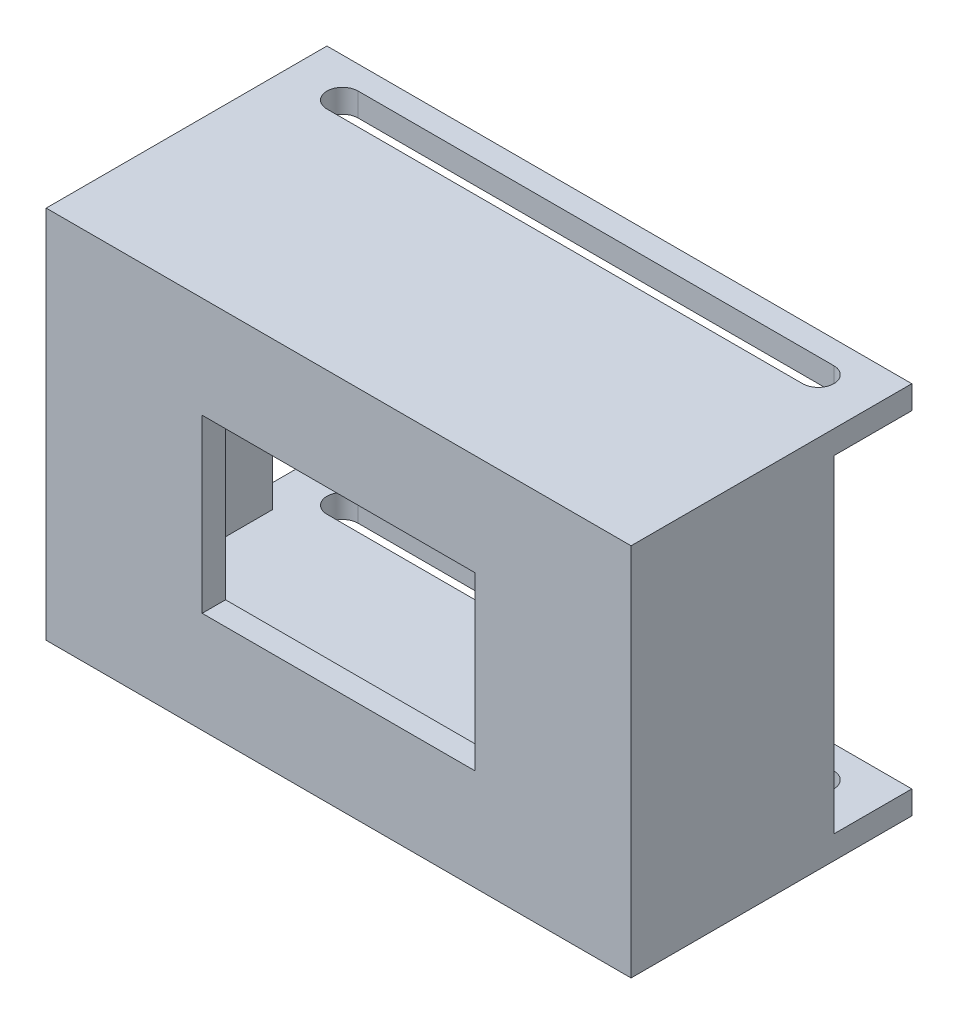
ISO-10303-21;
HEADER;
FILE_DESCRIPTION(('STEP AP214'),'2;1');
FILE_NAME('part.step','',(''),(''),'','','');
FILE_SCHEMA(('AUTOMOTIVE_DESIGN { 1 0 10303 214 1 1 1 1 }'));
ENDSEC;
DATA;
#1=APPLICATION_CONTEXT('core data for automotive mechanical design processes');
#2=APPLICATION_PROTOCOL_DEFINITION('international standard','automotive_design',2000,#1);
#3=PRODUCT_CONTEXT('',#1,'mechanical');
#4=PRODUCT('Part','Part','',(#3));
#5=PRODUCT_RELATED_PRODUCT_CATEGORY('part','',(#4));
#6=PRODUCT_DEFINITION_FORMATION('','',#4);
#7=PRODUCT_DEFINITION_CONTEXT('part definition',#1,'design');
#8=PRODUCT_DEFINITION('design','',#6,#7);
#9=PRODUCT_DEFINITION_SHAPE('','',#8);
#10=(LENGTH_UNIT() NAMED_UNIT(*) SI_UNIT(.MILLI.,.METRE.));
#11=(NAMED_UNIT(*) PLANE_ANGLE_UNIT() SI_UNIT($,.RADIAN.));
#12=(NAMED_UNIT(*) SI_UNIT($,.STERADIAN.) SOLID_ANGLE_UNIT());
#13=UNCERTAINTY_MEASURE_WITH_UNIT(LENGTH_MEASURE(1.E-05),#10,'distance_accuracy_value','');
#14=(GEOMETRIC_REPRESENTATION_CONTEXT(3) GLOBAL_UNCERTAINTY_ASSIGNED_CONTEXT((#13)) GLOBAL_UNIT_ASSIGNED_CONTEXT((#10,
#11,#12)) REPRESENTATION_CONTEXT('',''));
#15=CARTESIAN_POINT('',(0.,0.,0.));
#16=DIRECTION('',(0.,0.,1.));
#17=DIRECTION('',(1.,0.,0.));
#18=AXIS2_PLACEMENT_3D('',#15,#16,#17);
#19=CARTESIAN_POINT('',(0.,0.,0.));
#20=DIRECTION('',(0.,0.,1.));
#21=DIRECTION('',(1.,0.,0.));
#22=AXIS2_PLACEMENT_3D('',#19,#20,#21);
#23=PLANE('',#22);
#24=DIRECTION('',(1.,0.,0.));
#25=VECTOR('',#24,1.);
#26=CARTESIAN_POINT('',(-17.5,-11.,0.));
#27=LINE('',#26,#25);
#28=CARTESIAN_POINT('',(-17.5,-11.,0.));
#29=VERTEX_POINT('',#28);
#30=CARTESIAN_POINT('',(17.5,-11.,0.));
#31=VERTEX_POINT('',#30);
#32=EDGE_CURVE('E341',#29,#31,#27,.T.);
#33=ORIENTED_EDGE('',*,*,#32,.T.);
#34=DIRECTION('',(0.,1.,0.));
#35=VECTOR('',#34,1.);
#36=CARTESIAN_POINT('',(17.5,11.,0.));
#37=LINE('',#36,#35);
#38=CARTESIAN_POINT('',(17.5,11.,0.));
#39=VERTEX_POINT('',#38);
#40=EDGE_CURVE('E331',#31,#39,#37,.T.);
#41=ORIENTED_EDGE('',*,*,#40,.T.);
#42=DIRECTION('',(-1.,0.,0.));
#43=VECTOR('',#42,1.);
#44=CARTESIAN_POINT('',(-17.5,11.,0.));
#45=LINE('',#44,#43);
#46=CARTESIAN_POINT('',(-17.5,11.,0.));
#47=VERTEX_POINT('',#46);
#48=EDGE_CURVE('E334',#39,#47,#45,.T.);
#49=ORIENTED_EDGE('',*,*,#48,.T.);
#50=DIRECTION('',(0.,-1.,0.));
#51=VECTOR('',#50,1.);
#52=CARTESIAN_POINT('',(-17.5,11.,0.));
#53=LINE('',#52,#51);
#54=EDGE_CURVE('E338',#47,#29,#53,.T.);
#55=ORIENTED_EDGE('',*,*,#54,.T.);
#56=EDGE_LOOP('',(#33,#41,#49,#55));
#57=FACE_BOUND('',#56,.T.);
#58=DIRECTION('',(0.,-1.,0.));
#59=VECTOR('',#58,1.);
#60=CARTESIAN_POINT('',(-34.5,21.,0.));
#61=LINE('',#60,#59);
#62=CARTESIAN_POINT('',(-34.5,21.,0.));
#63=VERTEX_POINT('',#62);
#64=CARTESIAN_POINT('',(-34.5,-21.,0.));
#65=VERTEX_POINT('',#64);
#66=EDGE_CURVE('E260',#63,#65,#61,.T.);
#67=ORIENTED_EDGE('',*,*,#66,.F.);
#68=DIRECTION('',(-1.,0.,0.));
#69=VECTOR('',#68,1.);
#70=CARTESIAN_POINT('',(37.5,21.,0.));
#71=LINE('',#70,#69);
#72=CARTESIAN_POINT('',(34.5,21.,0.));
#73=VERTEX_POINT('',#72);
#74=EDGE_CURVE('E310',#73,#63,#71,.T.);
#75=ORIENTED_EDGE('',*,*,#74,.F.);
#76=DIRECTION('',(0.,1.,0.));
#77=VECTOR('',#76,1.);
#78=CARTESIAN_POINT('',(34.5,21.,0.));
#79=LINE('',#78,#77);
#80=CARTESIAN_POINT('',(34.5,-21.,0.));
#81=VERTEX_POINT('',#80);
#82=EDGE_CURVE('E275',#81,#73,#79,.T.);
#83=ORIENTED_EDGE('',*,*,#82,.F.);
#84=DIRECTION('',(1.,0.,0.));
#85=VECTOR('',#84,1.);
#86=CARTESIAN_POINT('',(-37.5,-21.,0.));
#87=LINE('',#86,#85);
#88=EDGE_CURVE('E291',#65,#81,#87,.T.);
#89=ORIENTED_EDGE('',*,*,#88,.F.);
#90=EDGE_LOOP('',(#67,#75,#83,#89));
#91=FACE_BOUND('',#90,.T.);
#92=ADVANCED_FACE('F34',(#57,#91),#23,.F.);
#93=CARTESIAN_POINT('',(37.5,21.,-33.));
#94=DIRECTION('',(0.,1.,0.));
#95=DIRECTION('',(0.,0.,1.));
#96=AXIS2_PLACEMENT_3D('',#93,#94,#95);
#97=PLANE('',#96);
#98=DIRECTION('',(-1.,0.,0.));
#99=VECTOR('',#98,1.);
#100=CARTESIAN_POINT('',(37.5,21.,-30.));
#101=LINE('',#100,#99);
#102=CARTESIAN_POINT('',(30.5,21.,-30.));
#103=VERTEX_POINT('',#102);
#104=CARTESIAN_POINT('',(-30.5,21.,-30.));
#105=VERTEX_POINT('',#104);
#106=EDGE_CURVE('E242',#103,#105,#101,.T.);
#107=ORIENTED_EDGE('',*,*,#106,.T.);
#108=CARTESIAN_POINT('',(-30.5,21.,-28.));
#109=DIRECTION('',(0.,1.,0.));
#110=DIRECTION('',(0.,0.,1.));
#111=AXIS2_PLACEMENT_3D('',#108,#109,#110);
#112=CIRCLE('',#111,2.);
#113=CARTESIAN_POINT('',(-30.5,21.,-26.));
#114=VERTEX_POINT('',#113);
#115=EDGE_CURVE('E199',#105,#114,#112,.T.);
#116=ORIENTED_EDGE('',*,*,#115,.T.);
#117=DIRECTION('',(1.,0.,0.));
#118=VECTOR('',#117,1.);
#119=CARTESIAN_POINT('',(37.5,21.,-26.));
#120=LINE('',#119,#118);
#121=CARTESIAN_POINT('',(30.5,21.,-26.));
#122=VERTEX_POINT('',#121);
#123=EDGE_CURVE('E253',#114,#122,#120,.T.);
#124=ORIENTED_EDGE('',*,*,#123,.T.);
#125=CARTESIAN_POINT('',(30.5,21.,-28.));
#126=DIRECTION('',(0.,1.,0.));
#127=DIRECTION('',(0.,0.,1.));
#128=AXIS2_PLACEMENT_3D('',#125,#126,#127);
#129=CIRCLE('',#128,2.);
#130=EDGE_CURVE('E247',#122,#103,#129,.T.);
#131=ORIENTED_EDGE('',*,*,#130,.T.);
#132=EDGE_LOOP('',(#107,#116,#124,#131));
#133=FACE_BOUND('',#132,.T.);
#134=DIRECTION('',(0.,0.,1.));
#135=VECTOR('',#134,1.);
#136=CARTESIAN_POINT('',(-34.5,21.,-23.));
#137=LINE('',#136,#135);
#138=CARTESIAN_POINT('',(-34.5,21.,-23.));
#139=VERTEX_POINT('',#138);
#140=EDGE_CURVE('E273',#139,#63,#137,.T.);
#141=ORIENTED_EDGE('',*,*,#140,.F.);
#142=DIRECTION('',(1.,0.,0.));
#143=VECTOR('',#142,1.);
#144=CARTESIAN_POINT('',(-37.5,21.,-23.));
#145=LINE('',#144,#143);
#146=CARTESIAN_POINT('',(-37.5,21.,-23.));
#147=VERTEX_POINT('',#146);
#148=EDGE_CURVE('E263',#147,#139,#145,.T.);
#149=ORIENTED_EDGE('',*,*,#148,.F.);
#150=DIRECTION('',(0.,0.,1.));
#151=VECTOR('',#150,1.);
#152=CARTESIAN_POINT('',(-37.5,21.,-33.));
#153=LINE('',#152,#151);
#154=CARTESIAN_POINT('',(-37.5,21.,-33.));
#155=VERTEX_POINT('',#154);
#156=EDGE_CURVE('E322',#155,#147,#153,.T.);
#157=ORIENTED_EDGE('',*,*,#156,.F.);
#158=DIRECTION('',(-1.,0.,0.));
#159=VECTOR('',#158,1.);
#160=CARTESIAN_POINT('',(37.5,21.,-33.));
#161=LINE('',#160,#159);
#162=CARTESIAN_POINT('',(37.5,21.,-33.));
#163=VERTEX_POINT('',#162);
#164=EDGE_CURVE('E314',#163,#155,#161,.T.);
#165=ORIENTED_EDGE('',*,*,#164,.F.);
#166=DIRECTION('',(0.,0.,1.));
#167=VECTOR('',#166,1.);
#168=CARTESIAN_POINT('',(37.5,21.,-33.));
#169=LINE('',#168,#167);
#170=CARTESIAN_POINT('',(37.5,21.,-23.));
#171=VERTEX_POINT('',#170);
#172=EDGE_CURVE('E327',#163,#171,#169,.T.);
#173=ORIENTED_EDGE('',*,*,#172,.T.);
#174=DIRECTION('',(1.,0.,0.));
#175=VECTOR('',#174,1.);
#176=CARTESIAN_POINT('',(37.5,21.,-23.));
#177=LINE('',#176,#175);
#178=CARTESIAN_POINT('',(34.5,21.,-23.));
#179=VERTEX_POINT('',#178);
#180=EDGE_CURVE('E282',#179,#171,#177,.T.);
#181=ORIENTED_EDGE('',*,*,#180,.F.);
#182=DIRECTION('',(0.,0.,1.));
#183=VECTOR('',#182,1.);
#184=CARTESIAN_POINT('',(34.5,21.,-23.));
#185=LINE('',#184,#183);
#186=EDGE_CURVE('E284',#179,#73,#185,.T.);
#187=ORIENTED_EDGE('',*,*,#186,.T.);
#188=ORIENTED_EDGE('',*,*,#74,.T.);
#189=EDGE_LOOP('',(#141,#149,#157,#165,#173,#181,#187,#188));
#190=FACE_BOUND('',#189,.T.);
#191=ADVANCED_FACE('F393',(#133,#190),#97,.F.);
#192=CARTESIAN_POINT('',(-37.5,-21.,-33.));
#193=DIRECTION('',(0.,-1.,0.));
#194=DIRECTION('',(1.,0.,0.));
#195=AXIS2_PLACEMENT_3D('',#192,#193,#194);
#196=PLANE('',#195);
#197=DIRECTION('',(-1.,0.,0.));
#198=VECTOR('',#197,1.);
#199=CARTESIAN_POINT('',(-37.5,-21.,-26.));
#200=LINE('',#199,#198);
#201=CARTESIAN_POINT('',(30.5,-21.,-26.));
#202=VERTEX_POINT('',#201);
#203=CARTESIAN_POINT('',(-30.5,-21.,-26.));
#204=VERTEX_POINT('',#203);
#205=EDGE_CURVE('E250',#202,#204,#200,.T.);
#206=ORIENTED_EDGE('',*,*,#205,.T.);
#207=CARTESIAN_POINT('',(-30.5,-21.,-28.));
#208=DIRECTION('',(0.,-1.,0.));
#209=DIRECTION('',(1.,0.,0.));
#210=AXIS2_PLACEMENT_3D('',#207,#208,#209);
#211=CIRCLE('',#210,2.);
#212=CARTESIAN_POINT('',(-30.5,-21.,-30.));
#213=VERTEX_POINT('',#212);
#214=EDGE_CURVE('E256',#204,#213,#211,.T.);
#215=ORIENTED_EDGE('',*,*,#214,.T.);
#216=DIRECTION('',(1.,0.,0.));
#217=VECTOR('',#216,1.);
#218=CARTESIAN_POINT('',(-37.5,-21.,-30.));
#219=LINE('',#218,#217);
#220=CARTESIAN_POINT('',(30.5,-21.,-30.));
#221=VERTEX_POINT('',#220);
#222=EDGE_CURVE('E233',#213,#221,#219,.T.);
#223=ORIENTED_EDGE('',*,*,#222,.T.);
#224=CARTESIAN_POINT('',(30.5,-21.,-28.));
#225=DIRECTION('',(0.,-1.,0.));
#226=DIRECTION('',(1.,0.,0.));
#227=AXIS2_PLACEMENT_3D('',#224,#225,#226);
#228=CIRCLE('',#227,2.);
#229=EDGE_CURVE('E244',#221,#202,#228,.T.);
#230=ORIENTED_EDGE('',*,*,#229,.T.);
#231=EDGE_LOOP('',(#206,#215,#223,#230));
#232=FACE_BOUND('',#231,.T.);
#233=DIRECTION('',(0.,0.,1.));
#234=VECTOR('',#233,1.);
#235=CARTESIAN_POINT('',(-34.5,-21.,-23.));
#236=LINE('',#235,#234);
#237=CARTESIAN_POINT('',(-34.5,-21.,-23.));
#238=VERTEX_POINT('',#237);
#239=EDGE_CURVE('E269',#238,#65,#236,.T.);
#240=ORIENTED_EDGE('',*,*,#239,.T.);
#241=ORIENTED_EDGE('',*,*,#88,.T.);
#242=DIRECTION('',(0.,0.,1.));
#243=VECTOR('',#242,1.);
#244=CARTESIAN_POINT('',(34.5,-21.,-23.));
#245=LINE('',#244,#243);
#246=CARTESIAN_POINT('',(34.5,-21.,-23.));
#247=VERTEX_POINT('',#246);
#248=EDGE_CURVE('E288',#247,#81,#245,.T.);
#249=ORIENTED_EDGE('',*,*,#248,.F.);
#250=DIRECTION('',(-1.,0.,0.));
#251=VECTOR('',#250,1.);
#252=CARTESIAN_POINT('',(37.5,-21.,-23.));
#253=LINE('',#252,#251);
#254=CARTESIAN_POINT('',(37.5,-21.,-23.));
#255=VERTEX_POINT('',#254);
#256=EDGE_CURVE('E278',#255,#247,#253,.T.);
#257=ORIENTED_EDGE('',*,*,#256,.F.);
#258=DIRECTION('',(0.,0.,1.));
#259=VECTOR('',#258,1.);
#260=CARTESIAN_POINT('',(37.5,-21.,-33.));
#261=LINE('',#260,#259);
#262=CARTESIAN_POINT('',(37.5,-21.,-33.));
#263=VERTEX_POINT('',#262);
#264=EDGE_CURVE('E303',#263,#255,#261,.T.);
#265=ORIENTED_EDGE('',*,*,#264,.F.);
#266=DIRECTION('',(1.,0.,0.));
#267=VECTOR('',#266,1.);
#268=CARTESIAN_POINT('',(-37.5,-21.,-33.));
#269=LINE('',#268,#267);
#270=CARTESIAN_POINT('',(-37.5,-21.,-33.));
#271=VERTEX_POINT('',#270);
#272=EDGE_CURVE('E295',#271,#263,#269,.T.);
#273=ORIENTED_EDGE('',*,*,#272,.F.);
#274=DIRECTION('',(0.,0.,1.));
#275=VECTOR('',#274,1.);
#276=CARTESIAN_POINT('',(-37.5,-21.,-33.));
#277=LINE('',#276,#275);
#278=CARTESIAN_POINT('',(-37.5,-21.,-23.));
#279=VERTEX_POINT('',#278);
#280=EDGE_CURVE('E307',#271,#279,#277,.T.);
#281=ORIENTED_EDGE('',*,*,#280,.T.);
#282=DIRECTION('',(-1.,0.,0.));
#283=VECTOR('',#282,1.);
#284=CARTESIAN_POINT('',(-37.5,-21.,-23.));
#285=LINE('',#284,#283);
#286=EDGE_CURVE('E267',#238,#279,#285,.T.);
#287=ORIENTED_EDGE('',*,*,#286,.F.);
#288=EDGE_LOOP('',(#240,#241,#249,#257,#265,#273,#281,#287));
#289=FACE_BOUND('',#288,.T.);
#290=ADVANCED_FACE('F401',(#232,#289),#196,.F.);
#291=CARTESIAN_POINT('',(37.5,24.,3.));
#292=DIRECTION('',(-1.,0.,0.));
#293=DIRECTION('',(0.,0.,1.));
#294=AXIS2_PLACEMENT_3D('',#291,#292,#293);
#295=PLANE('',#294);
#296=DIRECTION('',(0.,0.,-1.));
#297=VECTOR('',#296,1.);
#298=CARTESIAN_POINT('',(37.5,-24.,3.));
#299=LINE('',#298,#297);
#300=CARTESIAN_POINT('',(37.5,-24.,3.));
#301=VERTEX_POINT('',#300);
#302=CARTESIAN_POINT('',(37.5,-24.,-33.));
#303=VERTEX_POINT('',#302);
#304=EDGE_CURVE('E371',#301,#303,#299,.T.);
#305=ORIENTED_EDGE('',*,*,#304,.T.);
#306=DIRECTION('',(0.,-1.,0.));
#307=VECTOR('',#306,1.);
#308=CARTESIAN_POINT('',(37.5,-24.,-33.));
#309=LINE('',#308,#307);
#310=EDGE_CURVE('E297',#263,#303,#309,.T.);
#311=ORIENTED_EDGE('',*,*,#310,.F.);
#312=ORIENTED_EDGE('',*,*,#264,.T.);
#313=DIRECTION('',(0.,-1.,0.));
#314=VECTOR('',#313,1.);
#315=CARTESIAN_POINT('',(37.5,21.,-23.));
#316=LINE('',#315,#314);
#317=EDGE_CURVE('E276',#171,#255,#316,.T.);
#318=ORIENTED_EDGE('',*,*,#317,.F.);
#319=ORIENTED_EDGE('',*,*,#172,.F.);
#320=DIRECTION('',(0.,-1.,0.));
#321=VECTOR('',#320,1.);
#322=CARTESIAN_POINT('',(37.5,24.,-33.));
#323=LINE('',#322,#321);
#324=CARTESIAN_POINT('',(37.5,24.,-33.));
#325=VERTEX_POINT('',#324);
#326=EDGE_CURVE('E311',#325,#163,#323,.T.);
#327=ORIENTED_EDGE('',*,*,#326,.F.);
#328=DIRECTION('',(0.,0.,-1.));
#329=VECTOR('',#328,1.);
#330=CARTESIAN_POINT('',(37.5,24.,3.));
#331=LINE('',#330,#329);
#332=CARTESIAN_POINT('',(37.5,24.,3.));
#333=VERTEX_POINT('',#332);
#334=EDGE_CURVE('E11',#333,#325,#331,.T.);
#335=ORIENTED_EDGE('',*,*,#334,.F.);
#336=DIRECTION('',(0.,1.,0.));
#337=VECTOR('',#336,1.);
#338=CARTESIAN_POINT('',(37.5,24.,3.));
#339=LINE('',#338,#337);
#340=EDGE_CURVE('E356',#301,#333,#339,.T.);
#341=ORIENTED_EDGE('',*,*,#340,.F.);
#342=EDGE_LOOP('',(#305,#311,#312,#318,#319,#327,#335,#341));
#343=FACE_BOUND('',#342,.T.);
#344=ADVANCED_FACE('F36',(#343),#295,.F.);
#345=CARTESIAN_POINT('',(-37.5,24.,3.));
#346=DIRECTION('',(0.,-1.,0.));
#347=DIRECTION('',(0.,0.,-1.));
#348=AXIS2_PLACEMENT_3D('',#345,#346,#347);
#349=PLANE('',#348);
#350=DIRECTION('',(-1.,0.,0.));
#351=VECTOR('',#350,1.);
#352=CARTESIAN_POINT('',(-30.5,24.,-26.));
#353=LINE('',#352,#351);
#354=CARTESIAN_POINT('',(30.5,24.,-26.));
#355=VERTEX_POINT('',#354);
#356=CARTESIAN_POINT('',(-30.5,24.,-26.));
#357=VERTEX_POINT('',#356);
#358=EDGE_CURVE('E216',#355,#357,#353,.T.);
#359=ORIENTED_EDGE('',*,*,#358,.T.);
#360=CARTESIAN_POINT('',(-30.5,24.,-28.));
#361=DIRECTION('',(0.,-1.,0.));
#362=DIRECTION('',(0.,0.,-1.));
#363=AXIS2_PLACEMENT_3D('',#360,#361,#362);
#364=CIRCLE('',#363,2.);
#365=CARTESIAN_POINT('',(-30.5,24.,-30.));
#366=VERTEX_POINT('',#365);
#367=EDGE_CURVE('E196',#357,#366,#364,.T.);
#368=ORIENTED_EDGE('',*,*,#367,.T.);
#369=DIRECTION('',(1.,0.,0.));
#370=VECTOR('',#369,1.);
#371=CARTESIAN_POINT('',(-30.5,24.,-30.));
#372=LINE('',#371,#370);
#373=CARTESIAN_POINT('',(30.5,24.,-30.));
#374=VERTEX_POINT('',#373);
#375=EDGE_CURVE('E205',#366,#374,#372,.T.);
#376=ORIENTED_EDGE('',*,*,#375,.T.);
#377=CARTESIAN_POINT('',(30.5,24.,-28.));
#378=DIRECTION('',(0.,-1.,0.));
#379=DIRECTION('',(0.,0.,-1.));
#380=AXIS2_PLACEMENT_3D('',#377,#378,#379);
#381=CIRCLE('',#380,2.);
#382=EDGE_CURVE('E211',#374,#355,#381,.T.);
#383=ORIENTED_EDGE('',*,*,#382,.T.);
#384=EDGE_LOOP('',(#359,#368,#376,#383));
#385=FACE_BOUND('',#384,.T.);
#386=ORIENTED_EDGE('',*,*,#334,.T.);
#387=DIRECTION('',(1.,0.,0.));
#388=VECTOR('',#387,1.);
#389=CARTESIAN_POINT('',(37.5,24.,-33.));
#390=LINE('',#389,#388);
#391=CARTESIAN_POINT('',(-37.5,24.,-33.));
#392=VERTEX_POINT('',#391);
#393=EDGE_CURVE('E319',#392,#325,#390,.T.);
#394=ORIENTED_EDGE('',*,*,#393,.F.);
#395=DIRECTION('',(0.,0.,-1.));
#396=VECTOR('',#395,1.);
#397=CARTESIAN_POINT('',(-37.5,24.,3.));
#398=LINE('',#397,#396);
#399=CARTESIAN_POINT('',(-37.5,24.,3.));
#400=VERTEX_POINT('',#399);
#401=EDGE_CURVE('E42',#400,#392,#398,.T.);
#402=ORIENTED_EDGE('',*,*,#401,.F.);
#403=DIRECTION('',(-1.,0.,0.));
#404=VECTOR('',#403,1.);
#405=CARTESIAN_POINT('',(-37.5,24.,3.));
#406=LINE('',#405,#404);
#407=EDGE_CURVE('E365',#333,#400,#406,.T.);
#408=ORIENTED_EDGE('',*,*,#407,.F.);
#409=EDGE_LOOP('',(#386,#394,#402,#408));
#410=FACE_BOUND('',#409,.T.);
#411=ADVANCED_FACE('F213',(#385,#410),#349,.F.);
#412=CARTESIAN_POINT('',(-37.5,24.,3.));
#413=DIRECTION('',(1.,0.,0.));
#414=DIRECTION('',(0.,1.,0.));
#415=AXIS2_PLACEMENT_3D('',#412,#413,#414);
#416=PLANE('',#415);
#417=ORIENTED_EDGE('',*,*,#401,.T.);
#418=DIRECTION('',(0.,1.,0.));
#419=VECTOR('',#418,1.);
#420=CARTESIAN_POINT('',(-37.5,24.,-33.));
#421=LINE('',#420,#419);
#422=EDGE_CURVE('E316',#155,#392,#421,.T.);
#423=ORIENTED_EDGE('',*,*,#422,.F.);
#424=ORIENTED_EDGE('',*,*,#156,.T.);
#425=DIRECTION('',(0.,1.,0.));
#426=VECTOR('',#425,1.);
#427=CARTESIAN_POINT('',(-37.5,21.,-23.));
#428=LINE('',#427,#426);
#429=EDGE_CURVE('E261',#279,#147,#428,.T.);
#430=ORIENTED_EDGE('',*,*,#429,.F.);
#431=ORIENTED_EDGE('',*,*,#280,.F.);
#432=DIRECTION('',(0.,1.,0.));
#433=VECTOR('',#432,1.);
#434=CARTESIAN_POINT('',(-37.5,-24.,-33.));
#435=LINE('',#434,#433);
#436=CARTESIAN_POINT('',(-37.5,-24.,-33.));
#437=VERTEX_POINT('',#436);
#438=EDGE_CURVE('E292',#437,#271,#435,.T.);
#439=ORIENTED_EDGE('',*,*,#438,.F.);
#440=DIRECTION('',(0.,0.,-1.));
#441=VECTOR('',#440,1.);
#442=CARTESIAN_POINT('',(-37.5,-24.,3.));
#443=LINE('',#442,#441);
#444=CARTESIAN_POINT('',(-37.5,-24.,3.));
#445=VERTEX_POINT('',#444);
#446=EDGE_CURVE('E373',#445,#437,#443,.T.);
#447=ORIENTED_EDGE('',*,*,#446,.F.);
#448=DIRECTION('',(0.,-1.,0.));
#449=VECTOR('',#448,1.);
#450=CARTESIAN_POINT('',(-37.5,24.,3.));
#451=LINE('',#450,#449);
#452=EDGE_CURVE('E367',#400,#445,#451,.T.);
#453=ORIENTED_EDGE('',*,*,#452,.F.);
#454=EDGE_LOOP('',(#417,#423,#424,#430,#431,#439,#447,#453));
#455=FACE_BOUND('',#454,.T.);
#456=ADVANCED_FACE('F378',(#455),#416,.F.);
#457=CARTESIAN_POINT('',(-37.5,-24.,3.));
#458=DIRECTION('',(0.,1.,0.));
#459=DIRECTION('',(0.,0.,1.));
#460=AXIS2_PLACEMENT_3D('',#457,#458,#459);
#461=PLANE('',#460);
#462=DIRECTION('',(1.,0.,0.));
#463=VECTOR('',#462,1.);
#464=CARTESIAN_POINT('',(-30.5,-24.,-30.));
#465=LINE('',#464,#463);
#466=CARTESIAN_POINT('',(-30.5,-24.,-30.));
#467=VERTEX_POINT('',#466);
#468=CARTESIAN_POINT('',(30.5,-24.,-30.));
#469=VERTEX_POINT('',#468);
#470=EDGE_CURVE('E227',#467,#469,#465,.T.);
#471=ORIENTED_EDGE('',*,*,#470,.F.);
#472=CARTESIAN_POINT('',(-30.5,-24.,-28.));
#473=DIRECTION('',(0.,-1.,0.));
#474=DIRECTION('',(0.,0.,-1.));
#475=AXIS2_PLACEMENT_3D('',#472,#473,#474);
#476=CIRCLE('',#475,2.);
#477=CARTESIAN_POINT('',(-30.5,-24.,-26.));
#478=VERTEX_POINT('',#477);
#479=EDGE_CURVE('E225',#478,#467,#476,.T.);
#480=ORIENTED_EDGE('',*,*,#479,.F.);
#481=DIRECTION('',(-1.,0.,0.));
#482=VECTOR('',#481,1.);
#483=CARTESIAN_POINT('',(-30.5,-24.,-26.));
#484=LINE('',#483,#482);
#485=CARTESIAN_POINT('',(30.5,-24.,-26.));
#486=VERTEX_POINT('',#485);
#487=EDGE_CURVE('E217',#486,#478,#484,.T.);
#488=ORIENTED_EDGE('',*,*,#487,.F.);
#489=CARTESIAN_POINT('',(30.5,-24.,-28.));
#490=DIRECTION('',(0.,-1.,0.));
#491=DIRECTION('',(0.,0.,-1.));
#492=AXIS2_PLACEMENT_3D('',#489,#490,#491);
#493=CIRCLE('',#492,2.);
#494=EDGE_CURVE('E220',#469,#486,#493,.T.);
#495=ORIENTED_EDGE('',*,*,#494,.F.);
#496=EDGE_LOOP('',(#471,#480,#488,#495));
#497=FACE_BOUND('',#496,.T.);
#498=ORIENTED_EDGE('',*,*,#446,.T.);
#499=DIRECTION('',(-1.,0.,0.));
#500=VECTOR('',#499,1.);
#501=CARTESIAN_POINT('',(-37.5,-24.,-33.));
#502=LINE('',#501,#500);
#503=EDGE_CURVE('E300',#303,#437,#502,.T.);
#504=ORIENTED_EDGE('',*,*,#503,.F.);
#505=ORIENTED_EDGE('',*,*,#304,.F.);
#506=DIRECTION('',(1.,0.,0.));
#507=VECTOR('',#506,1.);
#508=CARTESIAN_POINT('',(-37.5,-24.,3.));
#509=LINE('',#508,#507);
#510=EDGE_CURVE('E369',#445,#301,#509,.T.);
#511=ORIENTED_EDGE('',*,*,#510,.F.);
#512=EDGE_LOOP('',(#498,#504,#505,#511));
#513=FACE_BOUND('',#512,.T.);
#514=ADVANCED_FACE('F411',(#497,#513),#461,.F.);
#515=CARTESIAN_POINT('',(0.,0.,3.));
#516=DIRECTION('',(0.,0.,1.));
#517=DIRECTION('',(1.,0.,0.));
#518=AXIS2_PLACEMENT_3D('',#515,#516,#517);
#519=PLANE('',#518);
#520=DIRECTION('',(0.,1.,0.));
#521=VECTOR('',#520,1.);
#522=CARTESIAN_POINT('',(17.5,11.,3.));
#523=LINE('',#522,#521);
#524=CARTESIAN_POINT('',(17.5,-11.,3.));
#525=VERTEX_POINT('',#524);
#526=CARTESIAN_POINT('',(17.5,11.,3.));
#527=VERTEX_POINT('',#526);
#528=EDGE_CURVE('E330',#525,#527,#523,.T.);
#529=ORIENTED_EDGE('',*,*,#528,.F.);
#530=DIRECTION('',(1.,0.,0.));
#531=VECTOR('',#530,1.);
#532=CARTESIAN_POINT('',(-17.5,-11.,3.));
#533=LINE('',#532,#531);
#534=CARTESIAN_POINT('',(-17.5,-11.,3.));
#535=VERTEX_POINT('',#534);
#536=EDGE_CURVE('E335',#535,#525,#533,.T.);
#537=ORIENTED_EDGE('',*,*,#536,.F.);
#538=DIRECTION('',(0.,-1.,0.));
#539=VECTOR('',#538,1.);
#540=CARTESIAN_POINT('',(-17.5,11.,3.));
#541=LINE('',#540,#539);
#542=CARTESIAN_POINT('',(-17.5,11.,3.));
#543=VERTEX_POINT('',#542);
#544=EDGE_CURVE('E349',#543,#535,#541,.T.);
#545=ORIENTED_EDGE('',*,*,#544,.F.);
#546=DIRECTION('',(-1.,0.,0.));
#547=VECTOR('',#546,1.);
#548=CARTESIAN_POINT('',(-17.5,11.,3.));
#549=LINE('',#548,#547);
#550=EDGE_CURVE('E346',#527,#543,#549,.T.);
#551=ORIENTED_EDGE('',*,*,#550,.F.);
#552=EDGE_LOOP('',(#529,#537,#545,#551));
#553=FACE_BOUND('',#552,.T.);
#554=ORIENTED_EDGE('',*,*,#340,.T.);
#555=ORIENTED_EDGE('',*,*,#407,.T.);
#556=ORIENTED_EDGE('',*,*,#452,.T.);
#557=ORIENTED_EDGE('',*,*,#510,.T.);
#558=EDGE_LOOP('',(#554,#555,#556,#557));
#559=FACE_BOUND('',#558,.T.);
#560=ADVANCED_FACE('F413',(#553,#559),#519,.T.);
#561=CARTESIAN_POINT('',(17.5,11.,0.));
#562=DIRECTION('',(1.,0.,0.));
#563=DIRECTION('',(0.,0.,-1.));
#564=AXIS2_PLACEMENT_3D('',#561,#562,#563);
#565=PLANE('',#564);
#566=ORIENTED_EDGE('',*,*,#528,.T.);
#567=DIRECTION('',(0.,0.,1.));
#568=VECTOR('',#567,1.);
#569=CARTESIAN_POINT('',(17.5,11.,0.));
#570=LINE('',#569,#568);
#571=EDGE_CURVE('E344',#39,#527,#570,.T.);
#572=ORIENTED_EDGE('',*,*,#571,.F.);
#573=ORIENTED_EDGE('',*,*,#40,.F.);
#574=DIRECTION('',(0.,0.,1.));
#575=VECTOR('',#574,1.);
#576=CARTESIAN_POINT('',(17.5,-11.,0.));
#577=LINE('',#576,#575);
#578=EDGE_CURVE('E354',#31,#525,#577,.T.);
#579=ORIENTED_EDGE('',*,*,#578,.T.);
#580=EDGE_LOOP('',(#566,#572,#573,#579));
#581=FACE_BOUND('',#580,.T.);
#582=ADVANCED_FACE('F415',(#581),#565,.F.);
#583=CARTESIAN_POINT('',(-17.5,-11.,0.));
#584=DIRECTION('',(0.,-1.,0.));
#585=DIRECTION('',(0.,0.,-1.));
#586=AXIS2_PLACEMENT_3D('',#583,#584,#585);
#587=PLANE('',#586);
#588=ORIENTED_EDGE('',*,*,#536,.T.);
#589=ORIENTED_EDGE('',*,*,#578,.F.);
#590=ORIENTED_EDGE('',*,*,#32,.F.);
#591=DIRECTION('',(0.,0.,1.));
#592=VECTOR('',#591,1.);
#593=CARTESIAN_POINT('',(-17.5,-11.,0.));
#594=LINE('',#593,#592);
#595=EDGE_CURVE('E357',#29,#535,#594,.T.);
#596=ORIENTED_EDGE('',*,*,#595,.T.);
#597=EDGE_LOOP('',(#588,#589,#590,#596));
#598=FACE_BOUND('',#597,.T.);
#599=ADVANCED_FACE('F422',(#598),#587,.F.);
#600=CARTESIAN_POINT('',(-17.5,11.,0.));
#601=DIRECTION('',(-1.,0.,0.));
#602=DIRECTION('',(0.,-1.,0.));
#603=AXIS2_PLACEMENT_3D('',#600,#601,#602);
#604=PLANE('',#603);
#605=ORIENTED_EDGE('',*,*,#544,.T.);
#606=ORIENTED_EDGE('',*,*,#595,.F.);
#607=ORIENTED_EDGE('',*,*,#54,.F.);
#608=DIRECTION('',(0.,0.,1.));
#609=VECTOR('',#608,1.);
#610=CARTESIAN_POINT('',(-17.5,11.,0.));
#611=LINE('',#610,#609);
#612=EDGE_CURVE('E359',#47,#543,#611,.T.);
#613=ORIENTED_EDGE('',*,*,#612,.T.);
#614=EDGE_LOOP('',(#605,#606,#607,#613));
#615=FACE_BOUND('',#614,.T.);
#616=ADVANCED_FACE('F458',(#615),#604,.F.);
#617=CARTESIAN_POINT('',(-17.5,11.,0.));
#618=DIRECTION('',(0.,1.,0.));
#619=DIRECTION('',(0.,0.,1.));
#620=AXIS2_PLACEMENT_3D('',#617,#618,#619);
#621=PLANE('',#620);
#622=ORIENTED_EDGE('',*,*,#550,.T.);
#623=ORIENTED_EDGE('',*,*,#612,.F.);
#624=ORIENTED_EDGE('',*,*,#48,.F.);
#625=ORIENTED_EDGE('',*,*,#571,.T.);
#626=EDGE_LOOP('',(#622,#623,#624,#625));
#627=FACE_BOUND('',#626,.T.);
#628=ADVANCED_FACE('F454',(#627),#621,.F.);
#629=CARTESIAN_POINT('',(0.,0.,-33.));
#630=DIRECTION('',(0.,0.,-1.));
#631=DIRECTION('',(-1.,0.,0.));
#632=AXIS2_PLACEMENT_3D('',#629,#630,#631);
#633=PLANE('',#632);
#634=ORIENTED_EDGE('',*,*,#326,.T.);
#635=ORIENTED_EDGE('',*,*,#164,.T.);
#636=ORIENTED_EDGE('',*,*,#422,.T.);
#637=ORIENTED_EDGE('',*,*,#393,.T.);
#638=EDGE_LOOP('',(#634,#635,#636,#637));
#639=FACE_BOUND('',#638,.T.);
#640=ADVANCED_FACE('F382',(#639),#633,.T.);
#641=CARTESIAN_POINT('',(0.,0.,-33.));
#642=DIRECTION('',(0.,0.,-1.));
#643=DIRECTION('',(-1.,0.,0.));
#644=AXIS2_PLACEMENT_3D('',#641,#642,#643);
#645=PLANE('',#644);
#646=ORIENTED_EDGE('',*,*,#438,.T.);
#647=ORIENTED_EDGE('',*,*,#272,.T.);
#648=ORIENTED_EDGE('',*,*,#310,.T.);
#649=ORIENTED_EDGE('',*,*,#503,.T.);
#650=EDGE_LOOP('',(#646,#647,#648,#649));
#651=FACE_BOUND('',#650,.T.);
#652=ADVANCED_FACE('F406',(#651),#645,.T.);
#653=CARTESIAN_POINT('',(34.5,21.,-23.));
#654=DIRECTION('',(1.,0.,0.));
#655=DIRECTION('',(0.,0.,-1.));
#656=AXIS2_PLACEMENT_3D('',#653,#654,#655);
#657=PLANE('',#656);
#658=ORIENTED_EDGE('',*,*,#82,.T.);
#659=ORIENTED_EDGE('',*,*,#186,.F.);
#660=DIRECTION('',(0.,1.,0.));
#661=VECTOR('',#660,1.);
#662=CARTESIAN_POINT('',(34.5,21.,-23.));
#663=LINE('',#662,#661);
#664=EDGE_CURVE('E280',#247,#179,#663,.T.);
#665=ORIENTED_EDGE('',*,*,#664,.F.);
#666=ORIENTED_EDGE('',*,*,#248,.T.);
#667=EDGE_LOOP('',(#658,#659,#665,#666));
#668=FACE_BOUND('',#667,.T.);
#669=ADVANCED_FACE('F486',(#668),#657,.F.);
#670=CARTESIAN_POINT('',(0.,0.,-23.));
#671=DIRECTION('',(0.,0.,-1.));
#672=DIRECTION('',(-1.,0.,0.));
#673=AXIS2_PLACEMENT_3D('',#670,#671,#672);
#674=PLANE('',#673);
#675=ORIENTED_EDGE('',*,*,#317,.T.);
#676=ORIENTED_EDGE('',*,*,#256,.T.);
#677=ORIENTED_EDGE('',*,*,#664,.T.);
#678=ORIENTED_EDGE('',*,*,#180,.T.);
#679=EDGE_LOOP('',(#675,#676,#677,#678));
#680=FACE_BOUND('',#679,.T.);
#681=ADVANCED_FACE('F492',(#680),#674,.T.);
#682=CARTESIAN_POINT('',(-34.5,21.,-23.));
#683=DIRECTION('',(-1.,0.,0.));
#684=DIRECTION('',(0.,-1.,0.));
#685=AXIS2_PLACEMENT_3D('',#682,#683,#684);
#686=PLANE('',#685);
#687=ORIENTED_EDGE('',*,*,#66,.T.);
#688=ORIENTED_EDGE('',*,*,#239,.F.);
#689=DIRECTION('',(0.,-1.,0.));
#690=VECTOR('',#689,1.);
#691=CARTESIAN_POINT('',(-34.5,21.,-23.));
#692=LINE('',#691,#690);
#693=EDGE_CURVE('E265',#139,#238,#692,.T.);
#694=ORIENTED_EDGE('',*,*,#693,.F.);
#695=ORIENTED_EDGE('',*,*,#140,.T.);
#696=EDGE_LOOP('',(#687,#688,#694,#695));
#697=FACE_BOUND('',#696,.T.);
#698=ADVANCED_FACE('F500',(#697),#686,.F.);
#699=CARTESIAN_POINT('',(0.,0.,-23.));
#700=DIRECTION('',(0.,0.,1.));
#701=DIRECTION('',(1.,0.,0.));
#702=AXIS2_PLACEMENT_3D('',#699,#700,#701);
#703=PLANE('',#702);
#704=ORIENTED_EDGE('',*,*,#429,.T.);
#705=ORIENTED_EDGE('',*,*,#148,.T.);
#706=ORIENTED_EDGE('',*,*,#693,.T.);
#707=ORIENTED_EDGE('',*,*,#286,.T.);
#708=EDGE_LOOP('',(#704,#705,#706,#707));
#709=FACE_BOUND('',#708,.T.);
#710=ADVANCED_FACE('F508',(#709),#703,.F.);
#711=CARTESIAN_POINT('',(-30.5,24.,-30.));
#712=DIRECTION('',(0.,0.,-1.));
#713=DIRECTION('',(-1.,0.,0.));
#714=AXIS2_PLACEMENT_3D('',#711,#712,#713);
#715=PLANE('',#714);
#716=DIRECTION('',(0.,-1.,0.));
#717=VECTOR('',#716,1.);
#718=CARTESIAN_POINT('',(-30.5,24.,-30.));
#719=LINE('',#718,#717);
#720=EDGE_CURVE('E201',#213,#467,#719,.T.);
#721=ORIENTED_EDGE('',*,*,#720,.T.);
#722=ORIENTED_EDGE('',*,*,#470,.T.);
#723=DIRECTION('',(0.,-1.,0.));
#724=VECTOR('',#723,1.);
#725=CARTESIAN_POINT('',(30.5,24.,-30.));
#726=LINE('',#725,#724);
#727=EDGE_CURVE('E57',#221,#469,#726,.T.);
#728=ORIENTED_EDGE('',*,*,#727,.F.);
#729=ORIENTED_EDGE('',*,*,#222,.F.);
#730=EDGE_LOOP('',(#721,#722,#728,#729));
#731=FACE_BOUND('',#730,.T.);
#732=ADVANCED_FACE('F516',(#731),#715,.F.);
#733=CARTESIAN_POINT('',(30.5,24.,-28.));
#734=DIRECTION('',(0.,-1.,0.));
#735=DIRECTION('',(0.,0.,-1.));
#736=AXIS2_PLACEMENT_3D('',#733,#734,#735);
#737=CYLINDRICAL_SURFACE('',#736,2.);
#738=ORIENTED_EDGE('',*,*,#727,.T.);
#739=ORIENTED_EDGE('',*,*,#494,.T.);
#740=DIRECTION('',(0.,-1.,0.));
#741=VECTOR('',#740,1.);
#742=CARTESIAN_POINT('',(30.5,24.,-26.));
#743=LINE('',#742,#741);
#744=EDGE_CURVE('E238',#202,#486,#743,.T.);
#745=ORIENTED_EDGE('',*,*,#744,.F.);
#746=ORIENTED_EDGE('',*,*,#229,.F.);
#747=EDGE_LOOP('',(#738,#739,#745,#746));
#748=FACE_BOUND('',#747,.T.);
#749=ADVANCED_FACE('F524',(#748),#737,.F.);
#750=CARTESIAN_POINT('',(-30.5,24.,-26.));
#751=DIRECTION('',(0.,0.,1.));
#752=DIRECTION('',(1.,0.,0.));
#753=AXIS2_PLACEMENT_3D('',#750,#751,#752);
#754=PLANE('',#753);
#755=ORIENTED_EDGE('',*,*,#744,.T.);
#756=ORIENTED_EDGE('',*,*,#487,.T.);
#757=DIRECTION('',(0.,-1.,0.));
#758=VECTOR('',#757,1.);
#759=CARTESIAN_POINT('',(-30.5,24.,-26.));
#760=LINE('',#759,#758);
#761=EDGE_CURVE('E234',#204,#478,#760,.T.);
#762=ORIENTED_EDGE('',*,*,#761,.F.);
#763=ORIENTED_EDGE('',*,*,#205,.F.);
#764=EDGE_LOOP('',(#755,#756,#762,#763));
#765=FACE_BOUND('',#764,.T.);
#766=ADVANCED_FACE('F532',(#765),#754,.F.);
#767=CARTESIAN_POINT('',(-30.5,24.,-28.));
#768=DIRECTION('',(0.,-1.,0.));
#769=DIRECTION('',(0.,0.,-1.));
#770=AXIS2_PLACEMENT_3D('',#767,#768,#769);
#771=CYLINDRICAL_SURFACE('',#770,2.);
#772=ORIENTED_EDGE('',*,*,#761,.T.);
#773=ORIENTED_EDGE('',*,*,#479,.T.);
#774=ORIENTED_EDGE('',*,*,#720,.F.);
#775=ORIENTED_EDGE('',*,*,#214,.F.);
#776=EDGE_LOOP('',(#772,#773,#774,#775));
#777=FACE_BOUND('',#776,.T.);
#778=ADVANCED_FACE('F541',(#777),#771,.F.);
#779=EDGE_CURVE('E49',#366,#105,#719,.T.);
#780=ORIENTED_EDGE('',*,*,#779,.F.);
#781=ORIENTED_EDGE('',*,*,#367,.F.);
#782=EDGE_CURVE('E231',#357,#114,#760,.T.);
#783=ORIENTED_EDGE('',*,*,#782,.T.);
#784=ORIENTED_EDGE('',*,*,#115,.F.);
#785=EDGE_LOOP('',(#780,#781,#783,#784));
#786=FACE_BOUND('',#785,.T.);
#787=ADVANCED_FACE('F193',(#786),#771,.F.);
#788=ORIENTED_EDGE('',*,*,#782,.F.);
#789=ORIENTED_EDGE('',*,*,#358,.F.);
#790=EDGE_CURVE('E235',#355,#122,#743,.T.);
#791=ORIENTED_EDGE('',*,*,#790,.T.);
#792=ORIENTED_EDGE('',*,*,#123,.F.);
#793=EDGE_LOOP('',(#788,#789,#791,#792));
#794=FACE_BOUND('',#793,.T.);
#795=ADVANCED_FACE('F544',(#794),#754,.F.);
#796=ORIENTED_EDGE('',*,*,#790,.F.);
#797=ORIENTED_EDGE('',*,*,#382,.F.);
#798=EDGE_CURVE('E208',#374,#103,#726,.T.);
#799=ORIENTED_EDGE('',*,*,#798,.T.);
#800=ORIENTED_EDGE('',*,*,#130,.F.);
#801=EDGE_LOOP('',(#796,#797,#799,#800));
#802=FACE_BOUND('',#801,.T.);
#803=ADVANCED_FACE('F535',(#802),#737,.F.);
#804=ORIENTED_EDGE('',*,*,#798,.F.);
#805=ORIENTED_EDGE('',*,*,#375,.F.);
#806=ORIENTED_EDGE('',*,*,#779,.T.);
#807=ORIENTED_EDGE('',*,*,#106,.F.);
#808=EDGE_LOOP('',(#804,#805,#806,#807));
#809=FACE_BOUND('',#808,.T.);
#810=ADVANCED_FACE('F206',(#809),#715,.F.);
#811=CLOSED_SHELL('',(#92,#191,#290,#344,#411,#456,#514,#560,#582,#599,#616,#628,#640,#652,#669,
#681,#698,#710,#732,#749,#766,#778,#787,#795,#803,#810));
#812=MANIFOLD_SOLID_BREP('B2',#811);
#813=ADVANCED_BREP_SHAPE_REPRESENTATION('',(#18,#812),#14);
#814=SHAPE_DEFINITION_REPRESENTATION(#9,#813);
ENDSEC;
END-ISO-10303-21;
